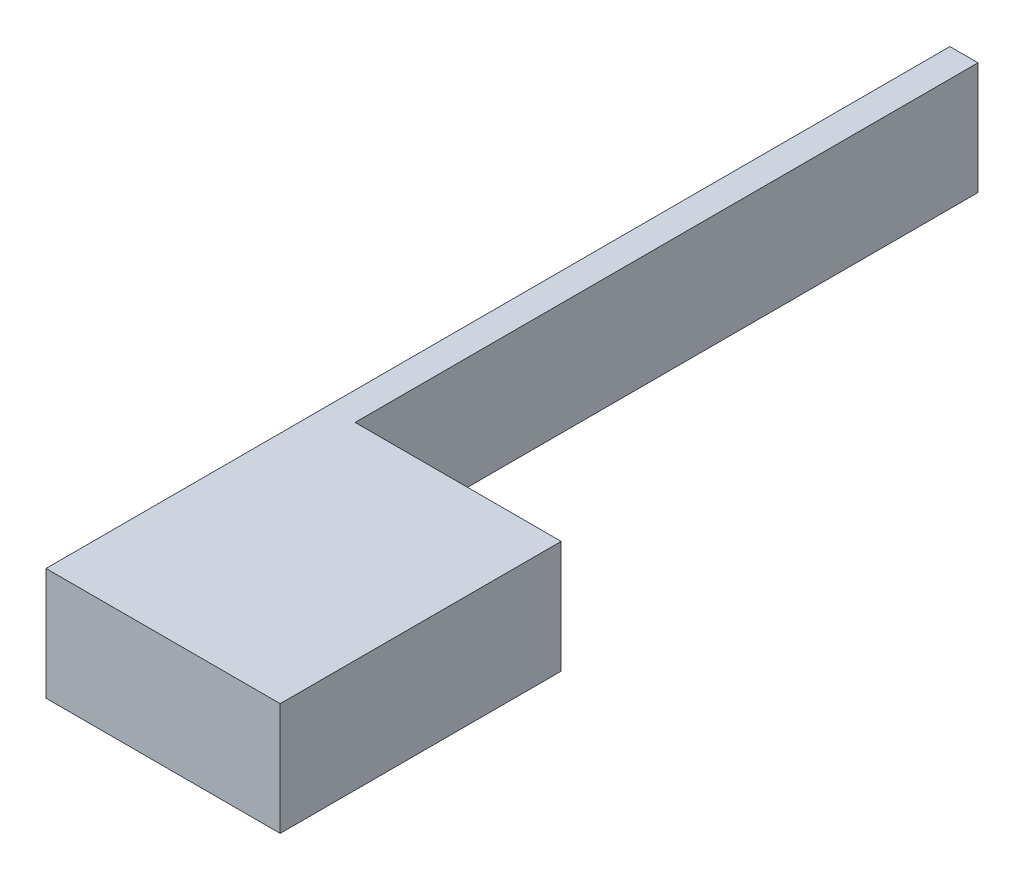
ISO-10303-21;
HEADER;
FILE_DESCRIPTION(('STEP AP214'),'2;1');
FILE_NAME('part.step','',(''),(''),'','','');
FILE_SCHEMA(('AUTOMOTIVE_DESIGN { 1 0 10303 214 1 1 1 1 }'));
ENDSEC;
DATA;
#1=APPLICATION_CONTEXT('core data for automotive mechanical design processes');
#2=APPLICATION_PROTOCOL_DEFINITION('international standard','automotive_design',2000,#1);
#3=PRODUCT_CONTEXT('',#1,'mechanical');
#4=PRODUCT('Part','Part','',(#3));
#5=PRODUCT_RELATED_PRODUCT_CATEGORY('part','',(#4));
#6=PRODUCT_DEFINITION_FORMATION('','',#4);
#7=PRODUCT_DEFINITION_CONTEXT('part definition',#1,'design');
#8=PRODUCT_DEFINITION('design','',#6,#7);
#9=PRODUCT_DEFINITION_SHAPE('','',#8);
#10=(LENGTH_UNIT() NAMED_UNIT(*) SI_UNIT(.MILLI.,.METRE.));
#11=(NAMED_UNIT(*) PLANE_ANGLE_UNIT() SI_UNIT($,.RADIAN.));
#12=(NAMED_UNIT(*) SI_UNIT($,.STERADIAN.) SOLID_ANGLE_UNIT());
#13=UNCERTAINTY_MEASURE_WITH_UNIT(LENGTH_MEASURE(1.E-05),#10,'distance_accuracy_value','');
#14=(GEOMETRIC_REPRESENTATION_CONTEXT(3) GLOBAL_UNCERTAINTY_ASSIGNED_CONTEXT((#13)) GLOBAL_UNIT_ASSIGNED_CONTEXT((#10,
#11,#12)) REPRESENTATION_CONTEXT('',''));
#15=CARTESIAN_POINT('',(0.,0.,0.));
#16=DIRECTION('',(0.,0.,1.));
#17=DIRECTION('',(1.,0.,0.));
#18=AXIS2_PLACEMENT_3D('',#15,#16,#17);
#19=CARTESIAN_POINT('',(3.,0.,0.));
#20=DIRECTION('',(-1.,0.,0.));
#21=DIRECTION('',(0.,0.,1.));
#22=AXIS2_PLACEMENT_3D('',#19,#20,#21);
#23=PLANE('',#22);
#24=DIRECTION('',(0.,1.,0.));
#25=VECTOR('',#24,1.);
#26=CARTESIAN_POINT('',(3.,12.,-30.));
#27=LINE('',#26,#25);
#28=CARTESIAN_POINT('',(3.,0.,-30.));
#29=VERTEX_POINT('',#28);
#30=CARTESIAN_POINT('',(3.,12.,-30.));
#31=VERTEX_POINT('',#30);
#32=EDGE_CURVE('E48',#29,#31,#27,.T.);
#33=ORIENTED_EDGE('',*,*,#32,.F.);
#34=DIRECTION('',(0.,0.,-1.));
#35=VECTOR('',#34,1.);
#36=CARTESIAN_POINT('',(3.,0.,0.));
#37=LINE('',#36,#35);
#38=CARTESIAN_POINT('',(3.,0.,-96.5));
#39=VERTEX_POINT('',#38);
#40=EDGE_CURVE('E85',#29,#39,#37,.T.);
#41=ORIENTED_EDGE('',*,*,#40,.T.);
#42=DIRECTION('',(0.,1.,0.));
#43=VECTOR('',#42,1.);
#44=CARTESIAN_POINT('',(3.,0.,-96.5));
#45=LINE('',#44,#43);
#46=CARTESIAN_POINT('',(3.,12.,-96.5));
#47=VERTEX_POINT('',#46);
#48=EDGE_CURVE('E54',#39,#47,#45,.T.);
#49=ORIENTED_EDGE('',*,*,#48,.T.);
#50=DIRECTION('',(0.,0.,1.));
#51=VECTOR('',#50,1.);
#52=CARTESIAN_POINT('',(3.,12.,0.));
#53=LINE('',#52,#51);
#54=EDGE_CURVE('E95',#47,#31,#53,.T.);
#55=ORIENTED_EDGE('',*,*,#54,.T.);
#56=EDGE_LOOP('',(#33,#41,#49,#55));
#57=FACE_BOUND('',#56,.T.);
#58=ADVANCED_FACE('F33',(#57),#23,.F.);
#59=CARTESIAN_POINT('',(3.,0.,0.));
#60=DIRECTION('',(0.,0.,-1.));
#61=DIRECTION('',(-1.,0.,0.));
#62=AXIS2_PLACEMENT_3D('',#59,#60,#61);
#63=PLANE('',#62);
#64=DIRECTION('',(0.,-1.,0.));
#65=VECTOR('',#64,1.);
#66=CARTESIAN_POINT('',(0.,0.,0.));
#67=LINE('',#66,#65);
#68=CARTESIAN_POINT('',(0.,12.,0.));
#69=VERTEX_POINT('',#68);
#70=CARTESIAN_POINT('',(0.,0.,0.));
#71=VERTEX_POINT('',#70);
#72=EDGE_CURVE('E92',#69,#71,#67,.T.);
#73=ORIENTED_EDGE('',*,*,#72,.T.);
#74=DIRECTION('',(-1.,0.,0.));
#75=VECTOR('',#74,1.);
#76=CARTESIAN_POINT('',(3.,0.,0.));
#77=LINE('',#76,#75);
#78=CARTESIAN_POINT('',(25.,0.,0.));
#79=VERTEX_POINT('',#78);
#80=EDGE_CURVE('E11',#79,#71,#77,.T.);
#81=ORIENTED_EDGE('',*,*,#80,.F.);
#82=DIRECTION('',(0.,-1.,0.));
#83=VECTOR('',#82,1.);
#84=CARTESIAN_POINT('',(25.,12.,0.));
#85=LINE('',#84,#83);
#86=CARTESIAN_POINT('',(25.,12.,0.));
#87=VERTEX_POINT('',#86);
#88=EDGE_CURVE('E94',#87,#79,#85,.T.);
#89=ORIENTED_EDGE('',*,*,#88,.F.);
#90=DIRECTION('',(-1.,0.,0.));
#91=VECTOR('',#90,1.);
#92=CARTESIAN_POINT('',(3.,12.,0.));
#93=LINE('',#92,#91);
#94=EDGE_CURVE('E78',#87,#69,#93,.T.);
#95=ORIENTED_EDGE('',*,*,#94,.T.);
#96=EDGE_LOOP('',(#73,#81,#89,#95));
#97=FACE_BOUND('',#96,.T.);
#98=ADVANCED_FACE('F35',(#97),#63,.F.);
#99=CARTESIAN_POINT('',(3.,0.,0.));
#100=DIRECTION('',(0.,1.,0.));
#101=DIRECTION('',(0.,0.,1.));
#102=AXIS2_PLACEMENT_3D('',#99,#100,#101);
#103=PLANE('',#102);
#104=DIRECTION('',(0.,0.,-1.));
#105=VECTOR('',#104,1.);
#106=CARTESIAN_POINT('',(0.,0.,0.));
#107=LINE('',#106,#105);
#108=CARTESIAN_POINT('',(0.,0.,-96.5));
#109=VERTEX_POINT('',#108);
#110=EDGE_CURVE('E98',#71,#109,#107,.T.);
#111=ORIENTED_EDGE('',*,*,#110,.T.);
#112=DIRECTION('',(-1.,0.,0.));
#113=VECTOR('',#112,1.);
#114=CARTESIAN_POINT('',(3.,0.,-96.5));
#115=LINE('',#114,#113);
#116=EDGE_CURVE('E41',#39,#109,#115,.T.);
#117=ORIENTED_EDGE('',*,*,#116,.F.);
#118=ORIENTED_EDGE('',*,*,#40,.F.);
#119=DIRECTION('',(-1.,0.,0.));
#120=VECTOR('',#119,1.);
#121=CARTESIAN_POINT('',(25.,0.,-30.));
#122=LINE('',#121,#120);
#123=CARTESIAN_POINT('',(25.,0.,-30.));
#124=VERTEX_POINT('',#123);
#125=EDGE_CURVE('E99',#124,#29,#122,.T.);
#126=ORIENTED_EDGE('',*,*,#125,.F.);
#127=DIRECTION('',(0.,0.,-1.));
#128=VECTOR('',#127,1.);
#129=CARTESIAN_POINT('',(25.,0.,0.));
#130=LINE('',#129,#128);
#131=EDGE_CURVE('E119',#79,#124,#130,.T.);
#132=ORIENTED_EDGE('',*,*,#131,.F.);
#133=ORIENTED_EDGE('',*,*,#80,.T.);
#134=EDGE_LOOP('',(#111,#117,#118,#126,#132,#133));
#135=FACE_BOUND('',#134,.T.);
#136=ADVANCED_FACE('F114',(#135),#103,.F.);
#137=CARTESIAN_POINT('',(3.,0.,-96.5));
#138=DIRECTION('',(0.,0.,1.));
#139=DIRECTION('',(1.,0.,0.));
#140=AXIS2_PLACEMENT_3D('',#137,#138,#139);
#141=PLANE('',#140);
#142=DIRECTION('',(0.,1.,0.));
#143=VECTOR('',#142,1.);
#144=CARTESIAN_POINT('',(0.,0.,-96.5));
#145=LINE('',#144,#143);
#146=CARTESIAN_POINT('',(0.,12.,-96.5));
#147=VERTEX_POINT('',#146);
#148=EDGE_CURVE('E86',#109,#147,#145,.T.);
#149=ORIENTED_EDGE('',*,*,#148,.T.);
#150=DIRECTION('',(-1.,0.,0.));
#151=VECTOR('',#150,1.);
#152=CARTESIAN_POINT('',(3.,12.,-96.5));
#153=LINE('',#152,#151);
#154=EDGE_CURVE('E81',#47,#147,#153,.T.);
#155=ORIENTED_EDGE('',*,*,#154,.F.);
#156=ORIENTED_EDGE('',*,*,#48,.F.);
#157=ORIENTED_EDGE('',*,*,#116,.T.);
#158=EDGE_LOOP('',(#149,#155,#156,#157));
#159=FACE_BOUND('',#158,.T.);
#160=ADVANCED_FACE('F112',(#159),#141,.F.);
#161=CARTESIAN_POINT('',(3.,12.,0.));
#162=DIRECTION('',(0.,-1.,0.));
#163=DIRECTION('',(0.,0.,-1.));
#164=AXIS2_PLACEMENT_3D('',#161,#162,#163);
#165=PLANE('',#164);
#166=DIRECTION('',(0.,0.,1.));
#167=VECTOR('',#166,1.);
#168=CARTESIAN_POINT('',(0.,12.,0.));
#169=LINE('',#168,#167);
#170=EDGE_CURVE('E74',#147,#69,#169,.T.);
#171=ORIENTED_EDGE('',*,*,#170,.T.);
#172=ORIENTED_EDGE('',*,*,#94,.F.);
#173=DIRECTION('',(0.,0.,1.));
#174=VECTOR('',#173,1.);
#175=CARTESIAN_POINT('',(25.,12.,0.));
#176=LINE('',#175,#174);
#177=CARTESIAN_POINT('',(25.,12.,-30.));
#178=VERTEX_POINT('',#177);
#179=EDGE_CURVE('E133',#178,#87,#176,.T.);
#180=ORIENTED_EDGE('',*,*,#179,.F.);
#181=DIRECTION('',(-1.,0.,0.));
#182=VECTOR('',#181,1.);
#183=CARTESIAN_POINT('',(25.,12.,-30.));
#184=LINE('',#183,#182);
#185=EDGE_CURVE('E103',#178,#31,#184,.T.);
#186=ORIENTED_EDGE('',*,*,#185,.T.);
#187=ORIENTED_EDGE('',*,*,#54,.F.);
#188=ORIENTED_EDGE('',*,*,#154,.T.);
#189=EDGE_LOOP('',(#171,#172,#180,#186,#187,#188));
#190=FACE_BOUND('',#189,.T.);
#191=ADVANCED_FACE('F76',(#190),#165,.F.);
#192=CARTESIAN_POINT('',(0.,0.,0.));
#193=DIRECTION('',(-1.,0.,0.));
#194=DIRECTION('',(0.,0.,1.));
#195=AXIS2_PLACEMENT_3D('',#192,#193,#194);
#196=PLANE('',#195);
#197=ORIENTED_EDGE('',*,*,#72,.F.);
#198=ORIENTED_EDGE('',*,*,#170,.F.);
#199=ORIENTED_EDGE('',*,*,#148,.F.);
#200=ORIENTED_EDGE('',*,*,#110,.F.);
#201=EDGE_LOOP('',(#197,#198,#199,#200));
#202=FACE_BOUND('',#201,.T.);
#203=ADVANCED_FACE('F97',(#202),#196,.T.);
#204=CARTESIAN_POINT('',(25.,12.,-30.));
#205=DIRECTION('',(0.,0.,1.));
#206=DIRECTION('',(0.,-1.,0.));
#207=AXIS2_PLACEMENT_3D('',#204,#205,#206);
#208=PLANE('',#207);
#209=ORIENTED_EDGE('',*,*,#32,.T.);
#210=ORIENTED_EDGE('',*,*,#185,.F.);
#211=DIRECTION('',(0.,1.,0.));
#212=VECTOR('',#211,1.);
#213=CARTESIAN_POINT('',(25.,12.,-30.));
#214=LINE('',#213,#212);
#215=EDGE_CURVE('E130',#124,#178,#214,.T.);
#216=ORIENTED_EDGE('',*,*,#215,.F.);
#217=ORIENTED_EDGE('',*,*,#125,.T.);
#218=EDGE_LOOP('',(#209,#210,#216,#217));
#219=FACE_BOUND('',#218,.T.);
#220=ADVANCED_FACE('F137',(#219),#208,.F.);
#221=CARTESIAN_POINT('',(25.,0.,0.));
#222=DIRECTION('',(1.,0.,0.));
#223=DIRECTION('',(0.,0.,-1.));
#224=AXIS2_PLACEMENT_3D('',#221,#222,#223);
#225=PLANE('',#224);
#226=ORIENTED_EDGE('',*,*,#88,.T.);
#227=ORIENTED_EDGE('',*,*,#131,.T.);
#228=ORIENTED_EDGE('',*,*,#215,.T.);
#229=ORIENTED_EDGE('',*,*,#179,.T.);
#230=EDGE_LOOP('',(#226,#227,#228,#229));
#231=FACE_BOUND('',#230,.T.);
#232=ADVANCED_FACE('F132',(#231),#225,.T.);
#233=CLOSED_SHELL('',(#58,#98,#136,#160,#191,#203,#220,#232));
#234=MANIFOLD_SOLID_BREP('B2',#233);
#235=ADVANCED_BREP_SHAPE_REPRESENTATION('',(#18,#234),#14);
#236=SHAPE_DEFINITION_REPRESENTATION(#9,#235);
ENDSEC;
END-ISO-10303-21;
